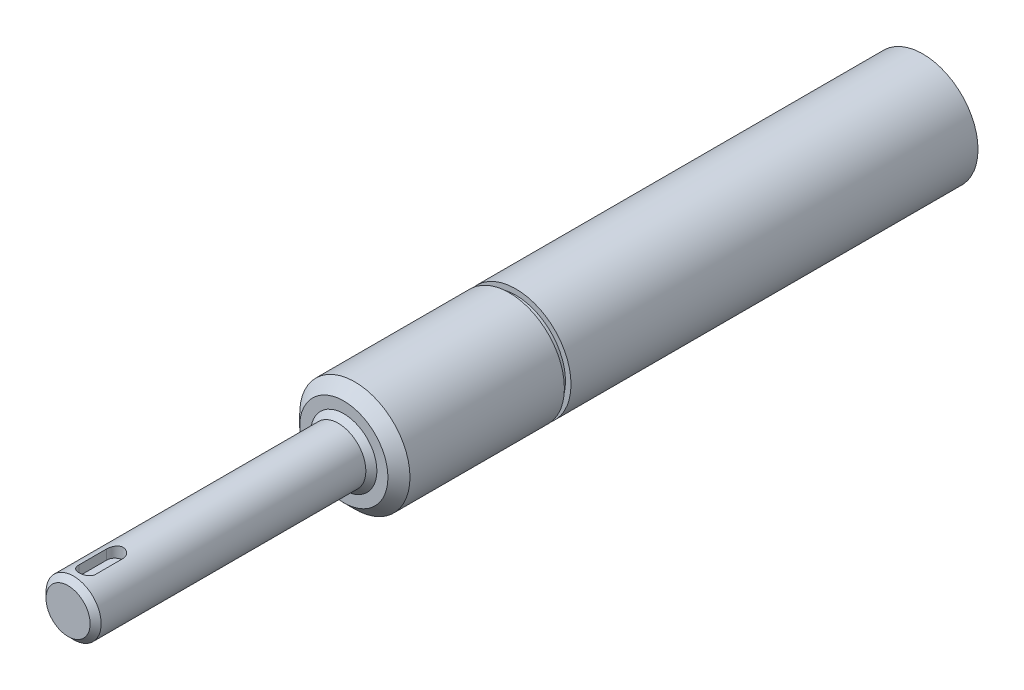
ISO-10303-21;
HEADER;
FILE_DESCRIPTION(('STEP AP214'),'2;1');
FILE_NAME('part.step','',(''),(''),'','','');
FILE_SCHEMA(('AUTOMOTIVE_DESIGN { 1 0 10303 214 1 1 1 1 }'));
ENDSEC;
DATA;
#1=APPLICATION_CONTEXT('core data for automotive mechanical design processes');
#2=APPLICATION_PROTOCOL_DEFINITION('international standard','automotive_design',2000,#1);
#3=PRODUCT_CONTEXT('',#1,'mechanical');
#4=PRODUCT('Part','Part','',(#3));
#5=PRODUCT_RELATED_PRODUCT_CATEGORY('part','',(#4));
#6=PRODUCT_DEFINITION_FORMATION('','',#4);
#7=PRODUCT_DEFINITION_CONTEXT('part definition',#1,'design');
#8=PRODUCT_DEFINITION('design','',#6,#7);
#9=PRODUCT_DEFINITION_SHAPE('','',#8);
#10=(LENGTH_UNIT() NAMED_UNIT(*) SI_UNIT(.MILLI.,.METRE.));
#11=(NAMED_UNIT(*) PLANE_ANGLE_UNIT() SI_UNIT($,.RADIAN.));
#12=(NAMED_UNIT(*) SI_UNIT($,.STERADIAN.) SOLID_ANGLE_UNIT());
#13=UNCERTAINTY_MEASURE_WITH_UNIT(LENGTH_MEASURE(1.E-05),#10,'distance_accuracy_value','');
#14=(GEOMETRIC_REPRESENTATION_CONTEXT(3) GLOBAL_UNCERTAINTY_ASSIGNED_CONTEXT((#13)) GLOBAL_UNIT_ASSIGNED_CONTEXT((#10,
#11,#12)) REPRESENTATION_CONTEXT('',''));
#15=CARTESIAN_POINT('',(0.,0.,0.));
#16=DIRECTION('',(0.,0.,1.));
#17=DIRECTION('',(1.,0.,0.));
#18=AXIS2_PLACEMENT_3D('',#15,#16,#17);
#19=CARTESIAN_POINT('',(0.,0.,105.));
#20=DIRECTION('',(0.,0.,-1.));
#21=DIRECTION('',(-1.,0.,0.));
#22=AXIS2_PLACEMENT_3D('',#19,#20,#21);
#23=CYLINDRICAL_SURFACE('',#22,10.);
#24=CARTESIAN_POINT('',(0.,0.,103.));
#25=DIRECTION('',(0.,0.,1.));
#26=DIRECTION('',(1.,0.,0.));
#27=AXIS2_PLACEMENT_3D('',#24,#25,#26);
#28=CIRCLE('',#27,10.);
#29=CARTESIAN_POINT('',(10.,0.,103.));
#30=VERTEX_POINT('',#29);
#31=EDGE_CURVE('E278',#30,#30,#28,.F.);
#32=ORIENTED_EDGE('',*,*,#31,.T.);
#33=EDGE_LOOP('',(#32));
#34=FACE_BOUND('',#33,.T.);
#35=CARTESIAN_POINT('',(0.,0.,75.));
#36=DIRECTION('',(0.,0.,1.));
#37=DIRECTION('',(1.,0.,0.));
#38=AXIS2_PLACEMENT_3D('',#35,#36,#37);
#39=CIRCLE('',#38,10.);
#40=CARTESIAN_POINT('',(10.,0.,75.));
#41=VERTEX_POINT('',#40);
#42=EDGE_CURVE('E215',#41,#41,#39,.T.);
#43=ORIENTED_EDGE('',*,*,#42,.T.);
#44=EDGE_LOOP('',(#43));
#45=FACE_BOUND('',#44,.T.);
#46=ADVANCED_FACE('F51',(#34,#45),#23,.T.);
#47=CARTESIAN_POINT('',(0.,0.,105.));
#48=DIRECTION('',(0.,0.,1.));
#49=DIRECTION('',(1.,0.,0.));
#50=AXIS2_PLACEMENT_3D('',#47,#48,#49);
#51=PLANE('',#50);
#52=CARTESIAN_POINT('',(0.,0.,105.));
#53=DIRECTION('',(0.,0.,1.));
#54=DIRECTION('',(1.,0.,0.));
#55=AXIS2_PLACEMENT_3D('',#52,#53,#54);
#56=CIRCLE('',#55,8.00000000000005);
#57=CARTESIAN_POINT('',(8.00000000000005,0.,105.));
#58=VERTEX_POINT('',#57);
#59=EDGE_CURVE('E270',#58,#58,#56,.T.);
#60=ORIENTED_EDGE('',*,*,#59,.T.);
#61=EDGE_LOOP('',(#60));
#62=FACE_BOUND('',#61,.T.);
#63=CARTESIAN_POINT('',(0.,0.,105.));
#64=DIRECTION('',(0.,0.,1.));
#65=DIRECTION('',(1.,0.,0.));
#66=AXIS2_PLACEMENT_3D('',#63,#64,#65);
#67=CIRCLE('',#66,5.99999999999999);
#68=CARTESIAN_POINT('',(5.99999999999999,0.,105.));
#69=VERTEX_POINT('',#68);
#70=EDGE_CURVE('E261',#69,#69,#67,.F.);
#71=ORIENTED_EDGE('',*,*,#70,.T.);
#72=EDGE_LOOP('',(#71));
#73=FACE_BOUND('',#72,.T.);
#74=ADVANCED_FACE('F186',(#62,#73),#51,.T.);
#75=CARTESIAN_POINT('',(0.,0.,155.));
#76=DIRECTION('',(0.,0.,-1.));
#77=DIRECTION('',(-1.,0.,0.));
#78=AXIS2_PLACEMENT_3D('',#75,#76,#77);
#79=CYLINDRICAL_SURFACE('',#78,5.);
#80=CARTESIAN_POINT('',(0.,0.,154.));
#81=DIRECTION('',(0.,0.,1.));
#82=DIRECTION('',(1.,0.,0.));
#83=AXIS2_PLACEMENT_3D('',#80,#81,#82);
#84=CIRCLE('',#83,5.);
#85=CARTESIAN_POINT('',(5.,0.,154.));
#86=VERTEX_POINT('',#85);
#87=EDGE_CURVE('E11',#86,#86,#84,.F.);
#88=ORIENTED_EDGE('',*,*,#87,.T.);
#89=EDGE_LOOP('',(#88));
#90=FACE_BOUND('',#89,.T.);
#91=CARTESIAN_POINT('',(0.,0.,106.));
#92=DIRECTION('',(0.,0.,1.));
#93=DIRECTION('',(1.,0.,0.));
#94=AXIS2_PLACEMENT_3D('',#91,#92,#93);
#95=CIRCLE('',#94,5.);
#96=CARTESIAN_POINT('',(5.,0.,106.));
#97=VERTEX_POINT('',#96);
#98=EDGE_CURVE('E264',#97,#97,#95,.T.);
#99=ORIENTED_EDGE('',*,*,#98,.T.);
#100=EDGE_LOOP('',(#99));
#101=FACE_BOUND('',#100,.T.);
#102=DIRECTION('',(0.,0.,-1.));
#103=VECTOR('',#102,1.);
#104=CARTESIAN_POINT('',(-1.49999999999999,4.76969600708473,155.));
#105=LINE('',#104,#103);
#106=CARTESIAN_POINT('',(-1.5,4.76969600708473,146.5));
#107=VERTEX_POINT('',#106);
#108=CARTESIAN_POINT('',(-1.49999999999999,4.76969600708473,151.5));
#109=VERTEX_POINT('',#108);
#110=EDGE_CURVE('E82',#107,#109,#105,.F.);
#111=ORIENTED_EDGE('',*,*,#110,.F.);
#112=CARTESIAN_POINT('',(-1.5,4.76969600708473,146.5));
#113=CARTESIAN_POINT('',(-1.5000008535707,4.76969249084934,146.458820607092));
#114=CARTESIAN_POINT('',(-1.49830317083427,4.77022997000129,146.417661956874));
#115=CARTESIAN_POINT('',(-1.49153785660316,4.77235095109999,146.335658837904));
#116=CARTESIAN_POINT('',(-1.4864709827584,4.77393421787376,146.294814300605));
#117=CARTESIAN_POINT('',(-1.4663020368931,4.78018490618873,146.173409459045));
#118=CARTESIAN_POINT('',(-1.44623120413662,4.78635370384275,146.093693609584));
#119=CARTESIAN_POINT('',(-1.39353102315626,4.80195952113208,145.938964421614));
#120=CARTESIAN_POINT('',(-1.36090607068203,4.81139539670393,145.863949447802));
#121=CARTESIAN_POINT('',(-1.28407841117656,4.83246571212052,145.720403318402));
#122=CARTESIAN_POINT('',(-1.23987031651226,4.84410117434933,145.651875200272));
#123=CARTESIAN_POINT('',(-1.13964850658325,4.86866835244721,145.521133944003));
#124=CARTESIAN_POINT('',(-1.08333433465207,4.88162755412974,145.459156339657));
#125=CARTESIAN_POINT('',(-0.961138919873351,4.90714811559049,145.3453644161));
#126=CARTESIAN_POINT('',(-0.895256063916352,4.91970940785249,145.293551813997));
#127=CARTESIAN_POINT('',(-0.75410992131544,4.94333239727705,145.200536229681));
#128=CARTESIAN_POINT('',(-0.678680819336268,4.95435770971354,145.159574819702));
#129=CARTESIAN_POINT('',(-0.52162118550578,4.97334469846208,145.091011588382));
#130=CARTESIAN_POINT('',(-0.439992259012931,4.98130716463903,145.063406322206));
#131=CARTESIAN_POINT('',(-0.275324697874879,4.99307639935002,145.023120200898));
#132=CARTESIAN_POINT('',(-0.192393125294254,4.99699549276993,145.01003514203));
#133=CARTESIAN_POINT('',(-0.0254235719980814,5.00063202022426,144.997882658637));
#134=CARTESIAN_POINT('',(0.0586141962423638,5.00035024971471,144.9988125803));
#135=CARTESIAN_POINT('',(0.222571599946022,4.99569602566267,145.014392908759));
#136=CARTESIAN_POINT('',(0.302537145464649,4.99145415509187,145.028605344979));
#137=CARTESIAN_POINT('',(0.45889005210203,4.9795151369998,145.069631635238));
#138=CARTESIAN_POINT('',(0.535277225531998,4.97181780846028,145.096446149456));
#139=CARTESIAN_POINT('',(0.683347815892217,4.95365214926145,145.162212221646));
#140=CARTESIAN_POINT('',(0.754966006044148,4.94315255692525,145.201301644357));
#141=CARTESIAN_POINT('',(0.890765529574429,4.92049624651755,145.290398590048));
#142=CARTESIAN_POINT('',(0.954945191614599,4.90833915735884,145.340408559479));
#143=CARTESIAN_POINT('',(1.07665450541275,4.88311673571409,145.452191988084));
#144=CARTESIAN_POINT('',(1.13383351478033,4.87003445449554,145.514343863761));
#145=CARTESIAN_POINT('',(1.23706769492487,4.84484215114658,145.647497423428));
#146=CARTESIAN_POINT('',(1.28311962013078,4.83273241337565,145.718501680366));
#147=CARTESIAN_POINT('',(1.36316407240864,4.81077228795653,145.868280928449));
#148=CARTESIAN_POINT('',(1.39703006341135,4.80094596245948,145.947127179593));
#149=CARTESIAN_POINT('',(1.45085886004699,4.78495663653201,146.109724503982));
#150=CARTESIAN_POINT('',(1.47084293218035,4.77878803475875,146.193467860714));
#151=CARTESIAN_POINT('',(1.4890120359008,4.77314032325006,146.31499488907));
#152=CARTESIAN_POINT('',(1.49313202989009,4.77185156275267,146.35189073418));
#153=CARTESIAN_POINT('',(1.49862355614855,4.77012928611782,146.425851479099));
#154=CARTESIAN_POINT('',(1.49999912968269,4.76969451246644,146.462916049664));
#155=CARTESIAN_POINT('',(1.5,4.76969600708473,146.5));
#156=B_SPLINE_CURVE_WITH_KNOTS('',3,(#112,#113,#114,#115,#116,#117,#118,#119,#120,#121,#122,
#123,#124,#125,#126,#127,#128,#129,#130,#131,#132,#133,#134,#135,#136,#137,#138,#139,#140,#141,
#142,#143,#144,#145,#146,#147,#148,#149,#150,#151,#152,#153,#154,#155),.UNSPECIFIED.,.F.,.F.,(4,
2,2,2,2,2,2,2,2,2,2,2,2,2,2,2,2,2,2,2,2,4),(0.,0.123459071219709,0.24689038885304,
0.492911349615204,0.738846245884286,0.984895736828092,1.23795510798804,1.49105719006935,
1.74939356197454,2.00766326783255,2.25854751319801,2.5093842528947,2.75223130012967,
2.99509107067835,3.2407824256273,3.48652887757005,3.7417256831098,3.99699683536776,
4.25484698071526,4.51230123440206,4.62365084745808,4.73483637253615),.UNSPECIFIED.);
#157=CARTESIAN_POINT('',(1.5,4.76969600708473,146.5));
#158=VERTEX_POINT('',#157);
#159=EDGE_CURVE('E149',#107,#158,#156,.T.);
#160=ORIENTED_EDGE('',*,*,#159,.T.);
#161=DIRECTION('',(0.,0.,-1.));
#162=VECTOR('',#161,1.);
#163=CARTESIAN_POINT('',(1.50000000000001,4.76969600708473,155.));
#164=LINE('',#163,#162);
#165=CARTESIAN_POINT('',(1.50000000000001,4.76969600708473,151.5));
#166=VERTEX_POINT('',#165);
#167=EDGE_CURVE('E272',#158,#166,#164,.F.);
#168=ORIENTED_EDGE('',*,*,#167,.T.);
#169=CARTESIAN_POINT('',(1.50000000000001,4.76969600708473,151.5));
#170=CARTESIAN_POINT('',(1.50000085357071,4.76969249084934,151.541179392908));
#171=CARTESIAN_POINT('',(1.49830317083428,4.77022997000129,151.582338043127));
#172=CARTESIAN_POINT('',(1.49153785660317,4.77235095109998,151.664341162096));
#173=CARTESIAN_POINT('',(1.48647098275842,4.77393421787376,151.705185699395));
#174=CARTESIAN_POINT('',(1.46630203689312,4.78018490618873,151.826590540955));
#175=CARTESIAN_POINT('',(1.44623120413663,4.78635370384274,151.906306390417));
#176=CARTESIAN_POINT('',(1.39353102315627,4.80195952113208,152.061035578386));
#177=CARTESIAN_POINT('',(1.36090607068204,4.81139539670393,152.136050552198));
#178=CARTESIAN_POINT('',(1.28407841117656,4.83246571212052,152.279596681598));
#179=CARTESIAN_POINT('',(1.23987031651227,4.84410117434933,152.348124799729));
#180=CARTESIAN_POINT('',(1.13964850658328,4.8686683524472,152.478866055997));
#181=CARTESIAN_POINT('',(1.0833343346521,4.88162755412974,152.540843660344));
#182=CARTESIAN_POINT('',(0.961138919873375,4.90714811559049,152.6546355839));
#183=CARTESIAN_POINT('',(0.895256063916371,4.91970940785249,152.706448186003));
#184=CARTESIAN_POINT('',(0.754109921315449,4.94333239727705,152.799463770319));
#185=CARTESIAN_POINT('',(0.678680819336272,4.95435770971354,152.840425180298));
#186=CARTESIAN_POINT('',(0.521621185505783,4.97334469846208,152.908988411619));
#187=CARTESIAN_POINT('',(0.439992259012938,4.98130716463903,152.936593677795));
#188=CARTESIAN_POINT('',(0.275324697874889,4.99307639935002,152.976879799102));
#189=CARTESIAN_POINT('',(0.192393125294264,4.99699549276993,152.98996485797));
#190=CARTESIAN_POINT('',(0.0254235719980903,5.00063202022426,153.002117341364));
#191=CARTESIAN_POINT('',(-0.0586141962423542,5.00035024971471,153.001187419701));
#192=CARTESIAN_POINT('',(-0.222571599946009,4.99569602566267,152.985607091241));
#193=CARTESIAN_POINT('',(-0.302537145464633,4.99145415509187,152.971394655022));
#194=CARTESIAN_POINT('',(-0.458890052102015,4.9795151369998,152.930368364762));
#195=CARTESIAN_POINT('',(-0.535277225531985,4.97181780846028,152.903553850544));
#196=CARTESIAN_POINT('',(-0.683347815892207,4.95365214926145,152.837787778354));
#197=CARTESIAN_POINT('',(-0.754966006044139,4.94315255692525,152.798698355643));
#198=CARTESIAN_POINT('',(-0.890765529574418,4.92049624651755,152.709601409952));
#199=CARTESIAN_POINT('',(-0.954945191614587,4.90833915735884,152.659591440522));
#200=CARTESIAN_POINT('',(-1.07665450541274,4.88311673571409,152.547808011917));
#201=CARTESIAN_POINT('',(-1.13383351478034,4.87003445449554,152.48565613624));
#202=CARTESIAN_POINT('',(-1.23706769492487,4.84484215114658,152.352502576573));
#203=CARTESIAN_POINT('',(-1.28311962013078,4.83273241337565,152.281498319635));
#204=CARTESIAN_POINT('',(-1.36316407240863,4.81077228795653,152.131719071551));
#205=CARTESIAN_POINT('',(-1.39703006341133,4.80094596245948,152.052872820407));
#206=CARTESIAN_POINT('',(-1.45085886004698,4.78495663653201,151.890275496019));
#207=CARTESIAN_POINT('',(-1.47084293218034,4.77878803475875,151.806532139286));
#208=CARTESIAN_POINT('',(-1.48901203590079,4.77314032325006,151.68500511093));
#209=CARTESIAN_POINT('',(-1.49313202989008,4.77185156275267,151.648109265821));
#210=CARTESIAN_POINT('',(-1.49862355614853,4.77012928611782,151.574148520901));
#211=CARTESIAN_POINT('',(-1.49999912968268,4.76969451246644,151.537083950337));
#212=CARTESIAN_POINT('',(-1.49999999999999,4.76969600708473,151.5));
#213=B_SPLINE_CURVE_WITH_KNOTS('',3,(#169,#170,#171,#172,#173,#174,#175,#176,#177,#178,#179,
#180,#181,#182,#183,#184,#185,#186,#187,#188,#189,#190,#191,#192,#193,#194,#195,#196,#197,#198,
#199,#200,#201,#202,#203,#204,#205,#206,#207,#208,#209,#210,#211,#212),.UNSPECIFIED.,.F.,.F.,(4,
2,2,2,2,2,2,2,2,2,2,2,2,2,2,2,2,2,2,2,2,4),(0.,0.123459071219709,0.246890388853012,
0.492911349615204,0.738846245884317,0.984895736828057,1.23795510798801,1.49105719006935,
1.74939356197454,2.00766326783255,2.25854751319802,2.5093842528947,2.75223130012966,
2.99509107067835,3.2407824256273,3.48652887757005,3.74172568310981,3.99699683536776,
4.25484698071526,4.51230123440206,4.62365084745806,4.73483637253615),.UNSPECIFIED.);
#214=EDGE_CURVE('E71',#166,#109,#213,.T.);
#215=ORIENTED_EDGE('',*,*,#214,.T.);
#216=EDGE_LOOP('',(#111,#160,#168,#215));
#217=FACE_BOUND('',#216,.T.);
#218=ADVANCED_FACE('F165',(#90,#101,#217),#79,.T.);
#219=CARTESIAN_POINT('',(0.,0.,155.));
#220=DIRECTION('',(0.,0.,1.));
#221=DIRECTION('',(1.,0.,0.));
#222=AXIS2_PLACEMENT_3D('',#219,#220,#221);
#223=PLANE('',#222);
#224=CARTESIAN_POINT('',(0.,0.,155.));
#225=DIRECTION('',(0.,0.,1.));
#226=DIRECTION('',(1.,0.,0.));
#227=AXIS2_PLACEMENT_3D('',#224,#225,#226);
#228=CIRCLE('',#227,4.);
#229=CARTESIAN_POINT('',(4.,0.,155.));
#230=VERTEX_POINT('',#229);
#231=EDGE_CURVE('E61',#230,#230,#228,.T.);
#232=ORIENTED_EDGE('',*,*,#231,.T.);
#233=EDGE_LOOP('',(#232));
#234=FACE_BOUND('',#233,.T.);
#235=ADVANCED_FACE('F180',(#234),#223,.T.);
#236=CARTESIAN_POINT('',(0.,3.,151.5));
#237=DIRECTION('',(0.,1.,0.));
#238=DIRECTION('',(0.,0.,1.));
#239=AXIS2_PLACEMENT_3D('',#236,#237,#238);
#240=CYLINDRICAL_SURFACE('',#239,1.5);
#241=DIRECTION('',(0.,1.,0.));
#242=VECTOR('',#241,1.);
#243=CARTESIAN_POINT('',(1.50000000000001,3.,151.5));
#244=LINE('',#243,#242);
#245=CARTESIAN_POINT('',(1.50000000000001,3.,151.5));
#246=VERTEX_POINT('',#245);
#247=EDGE_CURVE('E101',#246,#166,#244,.T.);
#248=ORIENTED_EDGE('',*,*,#247,.F.);
#249=CARTESIAN_POINT('',(0.,3.,151.5));
#250=DIRECTION('',(0.,1.,0.));
#251=DIRECTION('',(0.,0.,1.));
#252=AXIS2_PLACEMENT_3D('',#249,#250,#251);
#253=CIRCLE('',#252,1.5);
#254=CARTESIAN_POINT('',(-1.49999999999999,3.,151.5));
#255=VERTEX_POINT('',#254);
#256=EDGE_CURVE('E105',#255,#246,#253,.T.);
#257=ORIENTED_EDGE('',*,*,#256,.F.);
#258=DIRECTION('',(0.,1.,0.));
#259=VECTOR('',#258,1.);
#260=CARTESIAN_POINT('',(-1.49999999999999,3.,151.5));
#261=LINE('',#260,#259);
#262=EDGE_CURVE('E137',#255,#109,#261,.T.);
#263=ORIENTED_EDGE('',*,*,#262,.T.);
#264=ORIENTED_EDGE('',*,*,#214,.F.);
#265=EDGE_LOOP('',(#248,#257,#263,#264));
#266=FACE_BOUND('',#265,.T.);
#267=ADVANCED_FACE('F103',(#266),#240,.F.);
#268=CARTESIAN_POINT('',(-1.49999999999999,3.,151.5));
#269=DIRECTION('',(1.,0.,0.));
#270=DIRECTION('',(0.,0.,-1.));
#271=AXIS2_PLACEMENT_3D('',#268,#269,#270);
#272=PLANE('',#271);
#273=ORIENTED_EDGE('',*,*,#110,.T.);
#274=ORIENTED_EDGE('',*,*,#262,.F.);
#275=DIRECTION('',(0.,0.,-1.));
#276=VECTOR('',#275,1.);
#277=CARTESIAN_POINT('',(-1.49999999999999,3.,151.5));
#278=LINE('',#277,#276);
#279=CARTESIAN_POINT('',(-1.5,3.,146.5));
#280=VERTEX_POINT('',#279);
#281=EDGE_CURVE('E110',#255,#280,#278,.T.);
#282=ORIENTED_EDGE('',*,*,#281,.T.);
#283=DIRECTION('',(0.,1.,0.));
#284=VECTOR('',#283,1.);
#285=CARTESIAN_POINT('',(-1.5,3.,146.5));
#286=LINE('',#285,#284);
#287=EDGE_CURVE('E141',#280,#107,#286,.T.);
#288=ORIENTED_EDGE('',*,*,#287,.T.);
#289=EDGE_LOOP('',(#273,#274,#282,#288));
#290=FACE_BOUND('',#289,.T.);
#291=ADVANCED_FACE('F174',(#290),#272,.T.);
#292=CARTESIAN_POINT('',(0.,3.,146.5));
#293=DIRECTION('',(0.,1.,0.));
#294=DIRECTION('',(0.,0.,1.));
#295=AXIS2_PLACEMENT_3D('',#292,#293,#294);
#296=CYLINDRICAL_SURFACE('',#295,1.5);
#297=ORIENTED_EDGE('',*,*,#287,.F.);
#298=CARTESIAN_POINT('',(0.,3.,146.5));
#299=DIRECTION('',(0.,1.,0.));
#300=DIRECTION('',(0.,0.,1.));
#301=AXIS2_PLACEMENT_3D('',#298,#299,#300);
#302=CIRCLE('',#301,1.5);
#303=CARTESIAN_POINT('',(1.5,3.,146.5));
#304=VERTEX_POINT('',#303);
#305=EDGE_CURVE('E120',#304,#280,#302,.T.);
#306=ORIENTED_EDGE('',*,*,#305,.F.);
#307=DIRECTION('',(0.,1.,0.));
#308=VECTOR('',#307,1.);
#309=CARTESIAN_POINT('',(1.5,3.,146.5));
#310=LINE('',#309,#308);
#311=EDGE_CURVE('E109',#304,#158,#310,.T.);
#312=ORIENTED_EDGE('',*,*,#311,.T.);
#313=ORIENTED_EDGE('',*,*,#159,.F.);
#314=EDGE_LOOP('',(#297,#306,#312,#313));
#315=FACE_BOUND('',#314,.T.);
#316=ADVANCED_FACE('F169',(#315),#296,.F.);
#317=CARTESIAN_POINT('',(1.50000000000001,3.,151.5));
#318=DIRECTION('',(1.,0.,0.));
#319=DIRECTION('',(0.,0.,-1.));
#320=AXIS2_PLACEMENT_3D('',#317,#318,#319);
#321=PLANE('',#320);
#322=ORIENTED_EDGE('',*,*,#311,.F.);
#323=DIRECTION('',(0.,0.,-1.));
#324=VECTOR('',#323,1.);
#325=CARTESIAN_POINT('',(1.50000000000001,3.,151.5));
#326=LINE('',#325,#324);
#327=EDGE_CURVE('E113',#246,#304,#326,.T.);
#328=ORIENTED_EDGE('',*,*,#327,.F.);
#329=ORIENTED_EDGE('',*,*,#247,.T.);
#330=ORIENTED_EDGE('',*,*,#167,.F.);
#331=EDGE_LOOP('',(#322,#328,#329,#330));
#332=FACE_BOUND('',#331,.T.);
#333=ADVANCED_FACE('F114',(#332),#321,.F.);
#334=CARTESIAN_POINT('',(0.,3.,151.5));
#335=DIRECTION('',(0.,1.,0.));
#336=DIRECTION('',(0.,0.,1.));
#337=AXIS2_PLACEMENT_3D('',#334,#335,#336);
#338=PLANE('',#337);
#339=ORIENTED_EDGE('',*,*,#256,.T.);
#340=ORIENTED_EDGE('',*,*,#327,.T.);
#341=ORIENTED_EDGE('',*,*,#305,.T.);
#342=ORIENTED_EDGE('',*,*,#281,.F.);
#343=EDGE_LOOP('',(#339,#340,#341,#342));
#344=FACE_BOUND('',#343,.T.);
#345=ADVANCED_FACE('F123',(#344),#338,.T.);
#346=CARTESIAN_POINT('',(0.,0.,106.));
#347=DIRECTION('',(0.,0.,-1.));
#348=DIRECTION('',(-1.,0.,0.));
#349=AXIS2_PLACEMENT_3D('',#346,#347,#348);
#350=CONICAL_SURFACE('',#349,5.,0.78539816339745);
#351=ORIENTED_EDGE('',*,*,#70,.F.);
#352=EDGE_LOOP('',(#351));
#353=FACE_BOUND('',#352,.T.);
#354=ORIENTED_EDGE('',*,*,#98,.F.);
#355=EDGE_LOOP('',(#354));
#356=FACE_BOUND('',#355,.T.);
#357=ADVANCED_FACE('F241',(#353,#356),#350,.T.);
#358=CARTESIAN_POINT('',(0.,0.,105.));
#359=DIRECTION('',(0.,0.,-1.));
#360=DIRECTION('',(-1.,0.,0.));
#361=AXIS2_PLACEMENT_3D('',#358,#359,#360);
#362=CONICAL_SURFACE('',#361,8.00000000000005,0.785398163397443);
#363=ORIENTED_EDGE('',*,*,#31,.F.);
#364=EDGE_LOOP('',(#363));
#365=FACE_BOUND('',#364,.T.);
#366=ORIENTED_EDGE('',*,*,#59,.F.);
#367=EDGE_LOOP('',(#366));
#368=FACE_BOUND('',#367,.T.);
#369=ADVANCED_FACE('F237',(#365,#368),#362,.T.);
#370=CARTESIAN_POINT('',(0.,0.,155.));
#371=DIRECTION('',(0.,0.,-1.));
#372=DIRECTION('',(-1.,0.,0.));
#373=AXIS2_PLACEMENT_3D('',#370,#371,#372);
#374=CONICAL_SURFACE('',#373,4.,0.785398163397446);
#375=ORIENTED_EDGE('',*,*,#87,.F.);
#376=EDGE_LOOP('',(#375));
#377=FACE_BOUND('',#376,.T.);
#378=ORIENTED_EDGE('',*,*,#231,.F.);
#379=EDGE_LOOP('',(#378));
#380=FACE_BOUND('',#379,.T.);
#381=ADVANCED_FACE('F54',(#377,#380),#374,.T.);
#382=CARTESIAN_POINT('',(0.,0.,106.));
#383=DIRECTION('',(0.,0.,1.));
#384=DIRECTION('',(1.,0.,0.));
#385=AXIS2_PLACEMENT_3D('',#382,#383,#384);
#386=CYLINDRICAL_SURFACE('',#385,9.00000000000001);
#387=CARTESIAN_POINT('',(0.,0.,73.8));
#388=DIRECTION('',(0.,0.,1.));
#389=DIRECTION('',(1.,0.,0.));
#390=AXIS2_PLACEMENT_3D('',#387,#388,#389);
#391=CIRCLE('',#390,9.00000000000001);
#392=CARTESIAN_POINT('',(9.00000000000001,0.,73.8));
#393=VERTEX_POINT('',#392);
#394=EDGE_CURVE('E125',#393,#393,#391,.T.);
#395=ORIENTED_EDGE('',*,*,#394,.T.);
#396=EDGE_LOOP('',(#395));
#397=FACE_BOUND('',#396,.T.);
#398=CARTESIAN_POINT('',(0.,0.,75.));
#399=DIRECTION('',(0.,0.,1.));
#400=DIRECTION('',(1.,0.,0.));
#401=AXIS2_PLACEMENT_3D('',#398,#399,#400);
#402=CIRCLE('',#401,9.00000000000001);
#403=CARTESIAN_POINT('',(9.00000000000001,0.,75.));
#404=VERTEX_POINT('',#403);
#405=EDGE_CURVE('E218',#404,#404,#402,.T.);
#406=ORIENTED_EDGE('',*,*,#405,.F.);
#407=EDGE_LOOP('',(#406));
#408=FACE_BOUND('',#407,.T.);
#409=ADVANCED_FACE('F227',(#397,#408),#386,.T.);
#410=CARTESIAN_POINT('',(0.,0.,73.8));
#411=DIRECTION('',(0.,0.,1.));
#412=DIRECTION('',(1.,0.,0.));
#413=AXIS2_PLACEMENT_3D('',#410,#411,#412);
#414=PLANE('',#413);
#415=CARTESIAN_POINT('',(0.,0.,73.8));
#416=DIRECTION('',(0.,0.,1.));
#417=DIRECTION('',(1.,0.,0.));
#418=AXIS2_PLACEMENT_3D('',#415,#416,#417);
#419=CIRCLE('',#418,10.);
#420=CARTESIAN_POINT('',(10.,0.,73.8));
#421=VERTEX_POINT('',#420);
#422=EDGE_CURVE('E129',#421,#421,#419,.T.);
#423=ORIENTED_EDGE('',*,*,#422,.T.);
#424=EDGE_LOOP('',(#423));
#425=FACE_BOUND('',#424,.T.);
#426=ORIENTED_EDGE('',*,*,#394,.F.);
#427=EDGE_LOOP('',(#426));
#428=FACE_BOUND('',#427,.T.);
#429=ADVANCED_FACE('F229',(#425,#428),#414,.T.);
#430=CARTESIAN_POINT('',(0.,0.,75.));
#431=DIRECTION('',(0.,0.,-1.));
#432=DIRECTION('',(-1.,0.,0.));
#433=AXIS2_PLACEMENT_3D('',#430,#431,#432);
#434=PLANE('',#433);
#435=ORIENTED_EDGE('',*,*,#405,.T.);
#436=EDGE_LOOP('',(#435));
#437=FACE_BOUND('',#436,.T.);
#438=ORIENTED_EDGE('',*,*,#42,.F.);
#439=EDGE_LOOP('',(#438));
#440=FACE_BOUND('',#439,.T.);
#441=ADVANCED_FACE('F207',(#437,#440),#434,.T.);
#442=CARTESIAN_POINT('',(0.,0.,0.));
#443=DIRECTION('',(0.,0.,1.));
#444=DIRECTION('',(1.,0.,0.));
#445=AXIS2_PLACEMENT_3D('',#442,#443,#444);
#446=PLANE('',#445);
#447=CARTESIAN_POINT('',(0.,0.,0.));
#448=DIRECTION('',(0.,0.,1.));
#449=DIRECTION('',(1.,0.,0.));
#450=AXIS2_PLACEMENT_3D('',#447,#448,#449);
#451=CIRCLE('',#450,10.);
#452=CARTESIAN_POINT('',(10.,0.,0.));
#453=VERTEX_POINT('',#452);
#454=EDGE_CURVE('E140',#453,#453,#451,.T.);
#455=ORIENTED_EDGE('',*,*,#454,.F.);
#456=EDGE_LOOP('',(#455));
#457=FACE_BOUND('',#456,.T.);
#458=ADVANCED_FACE('F202',(#457),#446,.F.);
#459=ORIENTED_EDGE('',*,*,#454,.T.);
#460=EDGE_LOOP('',(#459));
#461=FACE_BOUND('',#460,.T.);
#462=ORIENTED_EDGE('',*,*,#422,.F.);
#463=EDGE_LOOP('',(#462));
#464=FACE_BOUND('',#463,.T.);
#465=ADVANCED_FACE('F192',(#461,#464),#23,.T.);
#466=CLOSED_SHELL('',(#46,#74,#218,#235,#267,#291,#316,#333,#345,#357,#369,#381,#409,#429,#441,
#458,#465));
#467=MANIFOLD_SOLID_BREP('B2',#466);
#468=ADVANCED_BREP_SHAPE_REPRESENTATION('',(#18,#467),#14);
#469=SHAPE_DEFINITION_REPRESENTATION(#9,#468);
ENDSEC;
END-ISO-10303-21;
